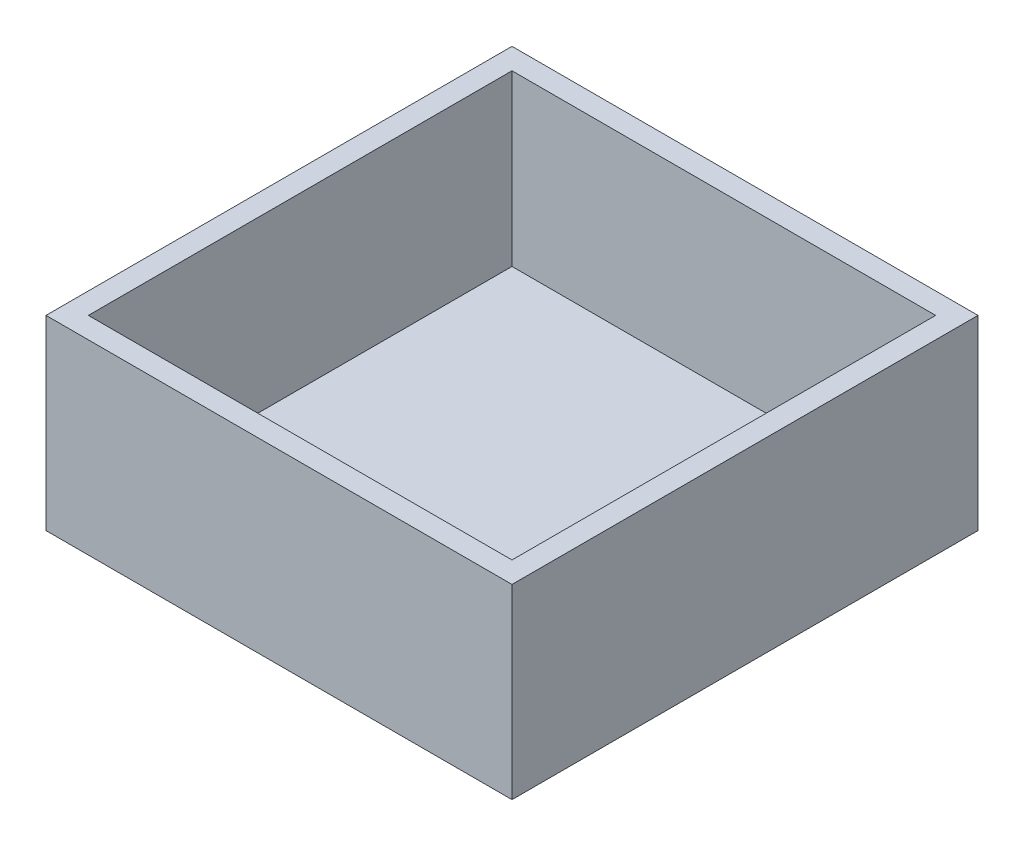
ISO-10303-21;
HEADER;
FILE_DESCRIPTION(('STEP AP214'),'2;1');
FILE_NAME('part.step','',(''),(''),'','','');
FILE_SCHEMA(('AUTOMOTIVE_DESIGN { 1 0 10303 214 1 1 1 1 }'));
ENDSEC;
DATA;
#1=APPLICATION_CONTEXT('core data for automotive mechanical design processes');
#2=APPLICATION_PROTOCOL_DEFINITION('international standard','automotive_design',2000,#1);
#3=PRODUCT_CONTEXT('',#1,'mechanical');
#4=PRODUCT('Part','Part','',(#3));
#5=PRODUCT_RELATED_PRODUCT_CATEGORY('part','',(#4));
#6=PRODUCT_DEFINITION_FORMATION('','',#4);
#7=PRODUCT_DEFINITION_CONTEXT('part definition',#1,'design');
#8=PRODUCT_DEFINITION('design','',#6,#7);
#9=PRODUCT_DEFINITION_SHAPE('','',#8);
#10=(LENGTH_UNIT() NAMED_UNIT(*) SI_UNIT(.MILLI.,.METRE.));
#11=(NAMED_UNIT(*) PLANE_ANGLE_UNIT() SI_UNIT($,.RADIAN.));
#12=(NAMED_UNIT(*) SI_UNIT($,.STERADIAN.) SOLID_ANGLE_UNIT());
#13=UNCERTAINTY_MEASURE_WITH_UNIT(LENGTH_MEASURE(1.E-05),#10,'distance_accuracy_value','');
#14=(GEOMETRIC_REPRESENTATION_CONTEXT(3) GLOBAL_UNCERTAINTY_ASSIGNED_CONTEXT((#13)) GLOBAL_UNIT_ASSIGNED_CONTEXT((#10,
#11,#12)) REPRESENTATION_CONTEXT('',''));
#15=CARTESIAN_POINT('',(0.,0.,0.));
#16=DIRECTION('',(0.,0.,1.));
#17=DIRECTION('',(1.,0.,0.));
#18=AXIS2_PLACEMENT_3D('',#15,#16,#17);
#19=CARTESIAN_POINT('',(0.,40.,0.));
#20=DIRECTION('',(0.,-1.,0.));
#21=DIRECTION('',(0.,0.,-1.));
#22=AXIS2_PLACEMENT_3D('',#19,#20,#21);
#23=PLANE('',#22);
#24=DIRECTION('',(-1.,0.,0.));
#25=VECTOR('',#24,1.);
#26=CARTESIAN_POINT('',(-5.,40.,-5.));
#27=LINE('',#26,#25);
#28=CARTESIAN_POINT('',(105.,40.,-5.));
#29=VERTEX_POINT('',#28);
#30=CARTESIAN_POINT('',(-5.,40.,-5.));
#31=VERTEX_POINT('',#30);
#32=EDGE_CURVE('E152',#29,#31,#27,.T.);
#33=ORIENTED_EDGE('',*,*,#32,.T.);
#34=DIRECTION('',(0.,0.,1.));
#35=VECTOR('',#34,1.);
#36=CARTESIAN_POINT('',(-5.,40.,-5.));
#37=LINE('',#36,#35);
#38=CARTESIAN_POINT('',(-4.99999999999999,40.,105.));
#39=VERTEX_POINT('',#38);
#40=EDGE_CURVE('E105',#31,#39,#37,.T.);
#41=ORIENTED_EDGE('',*,*,#40,.T.);
#42=DIRECTION('',(1.,0.,0.));
#43=VECTOR('',#42,1.);
#44=CARTESIAN_POINT('',(-4.99999999999999,40.,105.));
#45=LINE('',#44,#43);
#46=CARTESIAN_POINT('',(105.,40.,105.));
#47=VERTEX_POINT('',#46);
#48=EDGE_CURVE('E155',#39,#47,#45,.T.);
#49=ORIENTED_EDGE('',*,*,#48,.T.);
#50=DIRECTION('',(0.,0.,-1.));
#51=VECTOR('',#50,1.);
#52=CARTESIAN_POINT('',(105.,40.,-5.));
#53=LINE('',#52,#51);
#54=EDGE_CURVE('E58',#47,#29,#53,.T.);
#55=ORIENTED_EDGE('',*,*,#54,.T.);
#56=EDGE_LOOP('',(#33,#41,#49,#55));
#57=FACE_BOUND('',#56,.T.);
#58=DIRECTION('',(0.,0.,1.));
#59=VECTOR('',#58,1.);
#60=CARTESIAN_POINT('',(0.,40.,0.));
#61=LINE('',#60,#59);
#62=CARTESIAN_POINT('',(0.,40.,0.));
#63=VERTEX_POINT('',#62);
#64=CARTESIAN_POINT('',(0.,40.,100.));
#65=VERTEX_POINT('',#64);
#66=EDGE_CURVE('E125',#63,#65,#61,.T.);
#67=ORIENTED_EDGE('',*,*,#66,.F.);
#68=DIRECTION('',(-1.,0.,0.));
#69=VECTOR('',#68,1.);
#70=CARTESIAN_POINT('',(0.,40.,0.));
#71=LINE('',#70,#69);
#72=CARTESIAN_POINT('',(100.,40.,0.));
#73=VERTEX_POINT('',#72);
#74=EDGE_CURVE('E132',#73,#63,#71,.T.);
#75=ORIENTED_EDGE('',*,*,#74,.F.);
#76=DIRECTION('',(0.,0.,-1.));
#77=VECTOR('',#76,1.);
#78=CARTESIAN_POINT('',(100.,40.,0.));
#79=LINE('',#78,#77);
#80=CARTESIAN_POINT('',(100.,40.,100.));
#81=VERTEX_POINT('',#80);
#82=EDGE_CURVE('E130',#81,#73,#79,.T.);
#83=ORIENTED_EDGE('',*,*,#82,.F.);
#84=DIRECTION('',(1.,0.,0.));
#85=VECTOR('',#84,1.);
#86=CARTESIAN_POINT('',(0.,40.,100.));
#87=LINE('',#86,#85);
#88=EDGE_CURVE('E127',#65,#81,#87,.T.);
#89=ORIENTED_EDGE('',*,*,#88,.F.);
#90=EDGE_LOOP('',(#67,#75,#83,#89));
#91=FACE_BOUND('',#90,.T.);
#92=ADVANCED_FACE('F35',(#57,#91),#23,.F.);
#93=CARTESIAN_POINT('',(-5.,40.,-5.));
#94=DIRECTION('',(0.,0.,1.));
#95=DIRECTION('',(1.,0.,0.));
#96=AXIS2_PLACEMENT_3D('',#93,#94,#95);
#97=PLANE('',#96);
#98=DIRECTION('',(0.,-1.,0.));
#99=VECTOR('',#98,1.);
#100=CARTESIAN_POINT('',(105.,40.,-5.));
#101=LINE('',#100,#99);
#102=CARTESIAN_POINT('',(105.,-4.,-5.));
#103=VERTEX_POINT('',#102);
#104=EDGE_CURVE('E110',#29,#103,#101,.T.);
#105=ORIENTED_EDGE('',*,*,#104,.T.);
#106=DIRECTION('',(1.,0.,0.));
#107=VECTOR('',#106,1.);
#108=CARTESIAN_POINT('',(105.,-4.,-5.));
#109=LINE('',#108,#107);
#110=CARTESIAN_POINT('',(-5.,-4.,-5.));
#111=VERTEX_POINT('',#110);
#112=EDGE_CURVE('E109',#111,#103,#109,.T.);
#113=ORIENTED_EDGE('',*,*,#112,.F.);
#114=DIRECTION('',(0.,-1.,0.));
#115=VECTOR('',#114,1.);
#116=CARTESIAN_POINT('',(-5.,40.,-5.));
#117=LINE('',#116,#115);
#118=EDGE_CURVE('E11',#31,#111,#117,.T.);
#119=ORIENTED_EDGE('',*,*,#118,.F.);
#120=ORIENTED_EDGE('',*,*,#32,.F.);
#121=EDGE_LOOP('',(#105,#113,#119,#120));
#122=FACE_BOUND('',#121,.T.);
#123=ADVANCED_FACE('F37',(#122),#97,.F.);
#124=CARTESIAN_POINT('',(-5.,40.,-5.));
#125=DIRECTION('',(1.,0.,0.));
#126=DIRECTION('',(0.,0.,-1.));
#127=AXIS2_PLACEMENT_3D('',#124,#125,#126);
#128=PLANE('',#127);
#129=ORIENTED_EDGE('',*,*,#118,.T.);
#130=DIRECTION('',(0.,0.,-1.));
#131=VECTOR('',#130,1.);
#132=CARTESIAN_POINT('',(-5.,-4.,-5.));
#133=LINE('',#132,#131);
#134=CARTESIAN_POINT('',(-4.99999999999999,-4.,105.));
#135=VERTEX_POINT('',#134);
#136=EDGE_CURVE('E104',#135,#111,#133,.T.);
#137=ORIENTED_EDGE('',*,*,#136,.F.);
#138=DIRECTION('',(0.,-1.,0.));
#139=VECTOR('',#138,1.);
#140=CARTESIAN_POINT('',(-4.99999999999999,40.,105.));
#141=LINE('',#140,#139);
#142=EDGE_CURVE('E43',#39,#135,#141,.T.);
#143=ORIENTED_EDGE('',*,*,#142,.F.);
#144=ORIENTED_EDGE('',*,*,#40,.F.);
#145=EDGE_LOOP('',(#129,#137,#143,#144));
#146=FACE_BOUND('',#145,.T.);
#147=ADVANCED_FACE('F101',(#146),#128,.F.);
#148=CARTESIAN_POINT('',(-4.99999999999999,40.,105.));
#149=DIRECTION('',(0.,0.,-1.));
#150=DIRECTION('',(-1.,0.,0.));
#151=AXIS2_PLACEMENT_3D('',#148,#149,#150);
#152=PLANE('',#151);
#153=ORIENTED_EDGE('',*,*,#142,.T.);
#154=DIRECTION('',(-1.,0.,0.));
#155=VECTOR('',#154,1.);
#156=CARTESIAN_POINT('',(-4.99999999999999,-4.,105.));
#157=LINE('',#156,#155);
#158=CARTESIAN_POINT('',(105.,-4.,105.));
#159=VERTEX_POINT('',#158);
#160=EDGE_CURVE('E119',#159,#135,#157,.T.);
#161=ORIENTED_EDGE('',*,*,#160,.F.);
#162=DIRECTION('',(0.,-1.,0.));
#163=VECTOR('',#162,1.);
#164=CARTESIAN_POINT('',(105.,40.,105.));
#165=LINE('',#164,#163);
#166=EDGE_CURVE('E159',#47,#159,#165,.T.);
#167=ORIENTED_EDGE('',*,*,#166,.F.);
#168=ORIENTED_EDGE('',*,*,#48,.F.);
#169=EDGE_LOOP('',(#153,#161,#167,#168));
#170=FACE_BOUND('',#169,.T.);
#171=ADVANCED_FACE('F162',(#170),#152,.F.);
#172=CARTESIAN_POINT('',(105.,40.,-5.));
#173=DIRECTION('',(-1.,0.,0.));
#174=DIRECTION('',(0.,0.,1.));
#175=AXIS2_PLACEMENT_3D('',#172,#173,#174);
#176=PLANE('',#175);
#177=ORIENTED_EDGE('',*,*,#166,.T.);
#178=DIRECTION('',(0.,0.,1.));
#179=VECTOR('',#178,1.);
#180=CARTESIAN_POINT('',(105.,-4.,105.));
#181=LINE('',#180,#179);
#182=EDGE_CURVE('E114',#103,#159,#181,.T.);
#183=ORIENTED_EDGE('',*,*,#182,.F.);
#184=ORIENTED_EDGE('',*,*,#104,.F.);
#185=ORIENTED_EDGE('',*,*,#54,.F.);
#186=EDGE_LOOP('',(#177,#183,#184,#185));
#187=FACE_BOUND('',#186,.T.);
#188=ADVANCED_FACE('F198',(#187),#176,.F.);
#189=CARTESIAN_POINT('',(0.,40.,0.));
#190=DIRECTION('',(1.,0.,0.));
#191=DIRECTION('',(0.,0.,-1.));
#192=AXIS2_PLACEMENT_3D('',#189,#190,#191);
#193=PLANE('',#192);
#194=DIRECTION('',(0.,0.,1.));
#195=VECTOR('',#194,1.);
#196=CARTESIAN_POINT('',(0.,0.,0.));
#197=LINE('',#196,#195);
#198=CARTESIAN_POINT('',(0.,0.,0.));
#199=VERTEX_POINT('',#198);
#200=CARTESIAN_POINT('',(0.,0.,100.));
#201=VERTEX_POINT('',#200);
#202=EDGE_CURVE('E124',#199,#201,#197,.T.);
#203=ORIENTED_EDGE('',*,*,#202,.F.);
#204=DIRECTION('',(0.,-1.,0.));
#205=VECTOR('',#204,1.);
#206=CARTESIAN_POINT('',(0.,40.,0.));
#207=LINE('',#206,#205);
#208=EDGE_CURVE('E134',#63,#199,#207,.T.);
#209=ORIENTED_EDGE('',*,*,#208,.F.);
#210=ORIENTED_EDGE('',*,*,#66,.T.);
#211=DIRECTION('',(0.,-1.,0.));
#212=VECTOR('',#211,1.);
#213=CARTESIAN_POINT('',(0.,40.,100.));
#214=LINE('',#213,#212);
#215=EDGE_CURVE('E149',#65,#201,#214,.T.);
#216=ORIENTED_EDGE('',*,*,#215,.T.);
#217=EDGE_LOOP('',(#203,#209,#210,#216));
#218=FACE_BOUND('',#217,.T.);
#219=ADVANCED_FACE('F175',(#218),#193,.T.);
#220=CARTESIAN_POINT('',(0.,40.,100.));
#221=DIRECTION('',(0.,0.,-1.));
#222=DIRECTION('',(-1.,0.,0.));
#223=AXIS2_PLACEMENT_3D('',#220,#221,#222);
#224=PLANE('',#223);
#225=DIRECTION('',(1.,0.,0.));
#226=VECTOR('',#225,1.);
#227=CARTESIAN_POINT('',(0.,0.,100.));
#228=LINE('',#227,#226);
#229=CARTESIAN_POINT('',(100.,0.,100.));
#230=VERTEX_POINT('',#229);
#231=EDGE_CURVE('E137',#201,#230,#228,.T.);
#232=ORIENTED_EDGE('',*,*,#231,.F.);
#233=ORIENTED_EDGE('',*,*,#215,.F.);
#234=ORIENTED_EDGE('',*,*,#88,.T.);
#235=DIRECTION('',(0.,-1.,0.));
#236=VECTOR('',#235,1.);
#237=CARTESIAN_POINT('',(100.,40.,100.));
#238=LINE('',#237,#236);
#239=EDGE_CURVE('E147',#81,#230,#238,.T.);
#240=ORIENTED_EDGE('',*,*,#239,.T.);
#241=EDGE_LOOP('',(#232,#233,#234,#240));
#242=FACE_BOUND('',#241,.T.);
#243=ADVANCED_FACE('F177',(#242),#224,.T.);
#244=CARTESIAN_POINT('',(100.,40.,0.));
#245=DIRECTION('',(-1.,0.,0.));
#246=DIRECTION('',(0.,0.,1.));
#247=AXIS2_PLACEMENT_3D('',#244,#245,#246);
#248=PLANE('',#247);
#249=DIRECTION('',(0.,0.,-1.));
#250=VECTOR('',#249,1.);
#251=CARTESIAN_POINT('',(100.,0.,0.));
#252=LINE('',#251,#250);
#253=CARTESIAN_POINT('',(100.,0.,0.));
#254=VERTEX_POINT('',#253);
#255=EDGE_CURVE('E140',#230,#254,#252,.T.);
#256=ORIENTED_EDGE('',*,*,#255,.F.);
#257=ORIENTED_EDGE('',*,*,#239,.F.);
#258=ORIENTED_EDGE('',*,*,#82,.T.);
#259=DIRECTION('',(0.,-1.,0.));
#260=VECTOR('',#259,1.);
#261=CARTESIAN_POINT('',(100.,40.,0.));
#262=LINE('',#261,#260);
#263=EDGE_CURVE('E50',#73,#254,#262,.T.);
#264=ORIENTED_EDGE('',*,*,#263,.T.);
#265=EDGE_LOOP('',(#256,#257,#258,#264));
#266=FACE_BOUND('',#265,.T.);
#267=ADVANCED_FACE('F184',(#266),#248,.T.);
#268=CARTESIAN_POINT('',(0.,40.,0.));
#269=DIRECTION('',(0.,0.,1.));
#270=DIRECTION('',(1.,0.,0.));
#271=AXIS2_PLACEMENT_3D('',#268,#269,#270);
#272=PLANE('',#271);
#273=DIRECTION('',(-1.,0.,0.));
#274=VECTOR('',#273,1.);
#275=CARTESIAN_POINT('',(0.,0.,0.));
#276=LINE('',#275,#274);
#277=EDGE_CURVE('E128',#254,#199,#276,.T.);
#278=ORIENTED_EDGE('',*,*,#277,.F.);
#279=ORIENTED_EDGE('',*,*,#263,.F.);
#280=ORIENTED_EDGE('',*,*,#74,.T.);
#281=ORIENTED_EDGE('',*,*,#208,.T.);
#282=EDGE_LOOP('',(#278,#279,#280,#281));
#283=FACE_BOUND('',#282,.T.);
#284=ADVANCED_FACE('F182',(#283),#272,.T.);
#285=CARTESIAN_POINT('',(0.,0.,0.));
#286=DIRECTION('',(0.,1.,0.));
#287=DIRECTION('',(0.,0.,1.));
#288=AXIS2_PLACEMENT_3D('',#285,#286,#287);
#289=PLANE('',#288);
#290=ORIENTED_EDGE('',*,*,#277,.T.);
#291=ORIENTED_EDGE('',*,*,#202,.T.);
#292=ORIENTED_EDGE('',*,*,#231,.T.);
#293=ORIENTED_EDGE('',*,*,#255,.T.);
#294=EDGE_LOOP('',(#290,#291,#292,#293));
#295=FACE_BOUND('',#294,.T.);
#296=ADVANCED_FACE('F181',(#295),#289,.T.);
#297=CARTESIAN_POINT('',(0.,-4.,0.));
#298=DIRECTION('',(0.,1.,0.));
#299=DIRECTION('',(0.,0.,1.));
#300=AXIS2_PLACEMENT_3D('',#297,#298,#299);
#301=PLANE('',#300);
#302=ORIENTED_EDGE('',*,*,#136,.T.);
#303=ORIENTED_EDGE('',*,*,#112,.T.);
#304=ORIENTED_EDGE('',*,*,#182,.T.);
#305=ORIENTED_EDGE('',*,*,#160,.T.);
#306=EDGE_LOOP('',(#302,#303,#304,#305));
#307=FACE_BOUND('',#306,.T.);
#308=ADVANCED_FACE('F117',(#307),#301,.F.);
#309=CLOSED_SHELL('',(#92,#123,#147,#171,#188,#219,#243,#267,#284,#296,#308));
#310=MANIFOLD_SOLID_BREP('B2',#309);
#311=ADVANCED_BREP_SHAPE_REPRESENTATION('',(#18,#310),#14);
#312=SHAPE_DEFINITION_REPRESENTATION(#9,#311);
ENDSEC;
END-ISO-10303-21;
